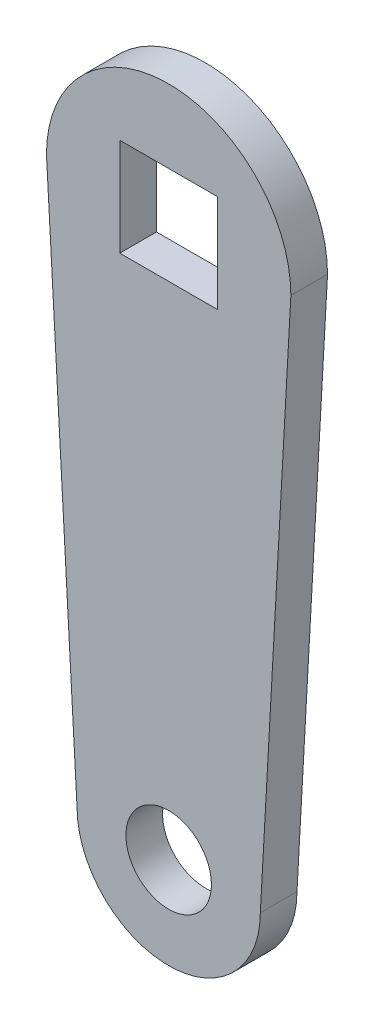
ISO-10303-21;
HEADER;
FILE_DESCRIPTION(('STEP AP214'),'2;1');
FILE_NAME('part.step','',(''),(''),'','','');
FILE_SCHEMA(('AUTOMOTIVE_DESIGN { 1 0 10303 214 1 1 1 1 }'));
ENDSEC;
DATA;
#1=APPLICATION_CONTEXT('core data for automotive mechanical design processes');
#2=APPLICATION_PROTOCOL_DEFINITION('international standard','automotive_design',2000,#1);
#3=PRODUCT_CONTEXT('',#1,'mechanical');
#4=PRODUCT('Part','Part','',(#3));
#5=PRODUCT_RELATED_PRODUCT_CATEGORY('part','',(#4));
#6=PRODUCT_DEFINITION_FORMATION('','',#4);
#7=PRODUCT_DEFINITION_CONTEXT('part definition',#1,'design');
#8=PRODUCT_DEFINITION('design','',#6,#7);
#9=PRODUCT_DEFINITION_SHAPE('','',#8);
#10=(LENGTH_UNIT() NAMED_UNIT(*) SI_UNIT(.MILLI.,.METRE.));
#11=(NAMED_UNIT(*) PLANE_ANGLE_UNIT() SI_UNIT($,.RADIAN.));
#12=(NAMED_UNIT(*) SI_UNIT($,.STERADIAN.) SOLID_ANGLE_UNIT());
#13=UNCERTAINTY_MEASURE_WITH_UNIT(LENGTH_MEASURE(1.E-05),#10,'distance_accuracy_value','');
#14=(GEOMETRIC_REPRESENTATION_CONTEXT(3) GLOBAL_UNCERTAINTY_ASSIGNED_CONTEXT((#13)) GLOBAL_UNIT_ASSIGNED_CONTEXT((#10,
#11,#12)) REPRESENTATION_CONTEXT('',''));
#15=CARTESIAN_POINT('',(0.,0.,0.));
#16=DIRECTION('',(0.,0.,1.));
#17=DIRECTION('',(1.,0.,0.));
#18=AXIS2_PLACEMENT_3D('',#15,#16,#17);
#19=CARTESIAN_POINT('',(0.,0.,3.));
#20=DIRECTION('',(0.,0.,1.));
#21=DIRECTION('',(1.,0.,0.));
#22=AXIS2_PLACEMENT_3D('',#19,#20,#21);
#23=PLANE('',#22);
#24=DIRECTION('',(1.,0.,0.));
#25=VECTOR('',#24,1.);
#26=CARTESIAN_POINT('',(4.,-4.,3.));
#27=LINE('',#26,#25);
#28=CARTESIAN_POINT('',(-4.,-4.,3.));
#29=VERTEX_POINT('',#28);
#30=CARTESIAN_POINT('',(4.,-4.,3.));
#31=VERTEX_POINT('',#30);
#32=EDGE_CURVE('E106',#29,#31,#27,.T.);
#33=ORIENTED_EDGE('',*,*,#32,.F.);
#34=DIRECTION('',(0.,-1.,0.));
#35=VECTOR('',#34,1.);
#36=CARTESIAN_POINT('',(-4.,-4.,3.));
#37=LINE('',#36,#35);
#38=CARTESIAN_POINT('',(-4.,4.,3.));
#39=VERTEX_POINT('',#38);
#40=EDGE_CURVE('E98',#39,#29,#37,.T.);
#41=ORIENTED_EDGE('',*,*,#40,.F.);
#42=DIRECTION('',(-1.,0.,0.));
#43=VECTOR('',#42,1.);
#44=CARTESIAN_POINT('',(4.,4.,3.));
#45=LINE('',#44,#43);
#46=CARTESIAN_POINT('',(4.,4.,3.));
#47=VERTEX_POINT('',#46);
#48=EDGE_CURVE('E121',#47,#39,#45,.T.);
#49=ORIENTED_EDGE('',*,*,#48,.F.);
#50=DIRECTION('',(0.,1.,0.));
#51=VECTOR('',#50,1.);
#52=CARTESIAN_POINT('',(4.,-4.,3.));
#53=LINE('',#52,#51);
#54=EDGE_CURVE('E119',#31,#47,#53,.T.);
#55=ORIENTED_EDGE('',*,*,#54,.F.);
#56=EDGE_LOOP('',(#33,#41,#49,#55));
#57=FACE_BOUND('',#56,.T.);
#58=CARTESIAN_POINT('',(0.,0.,3.));
#59=DIRECTION('',(0.,0.,1.));
#60=DIRECTION('',(1.,0.,0.));
#61=AXIS2_PLACEMENT_3D('',#58,#59,#60);
#62=CIRCLE('',#61,10.);
#63=CARTESIAN_POINT('',(10.,0.,3.));
#64=VERTEX_POINT('',#63);
#65=CARTESIAN_POINT('',(-10.,0.,3.));
#66=VERTEX_POINT('',#65);
#67=EDGE_CURVE('E137',#64,#66,#62,.T.);
#68=ORIENTED_EDGE('',*,*,#67,.T.);
#69=DIRECTION('',(0.055470019622523,-0.998460353205412,0.));
#70=VECTOR('',#69,1.);
#71=CARTESIAN_POINT('',(-10.,0.,3.));
#72=LINE('',#71,#70);
#73=CARTESIAN_POINT('',(-7.49999999999999,-45.,3.));
#74=VERTEX_POINT('',#73);
#75=EDGE_CURVE('E140',#66,#74,#72,.T.);
#76=ORIENTED_EDGE('',*,*,#75,.T.);
#77=CARTESIAN_POINT('',(0.,-45.,3.));
#78=DIRECTION('',(0.,0.,1.));
#79=DIRECTION('',(1.,0.,0.));
#80=AXIS2_PLACEMENT_3D('',#77,#78,#79);
#81=CIRCLE('',#80,7.5);
#82=CARTESIAN_POINT('',(7.50000000000001,-45.,3.));
#83=VERTEX_POINT('',#82);
#84=EDGE_CURVE('E143',#74,#83,#81,.T.);
#85=ORIENTED_EDGE('',*,*,#84,.T.);
#86=DIRECTION('',(0.0554700196225228,0.998460353205412,0.));
#87=VECTOR('',#86,1.);
#88=CARTESIAN_POINT('',(7.50000000000001,-45.,3.));
#89=LINE('',#88,#87);
#90=EDGE_CURVE('E145',#83,#64,#89,.T.);
#91=ORIENTED_EDGE('',*,*,#90,.T.);
#92=EDGE_LOOP('',(#68,#76,#85,#91));
#93=FACE_BOUND('',#92,.T.);
#94=CARTESIAN_POINT('',(0.,-45.,3.));
#95=DIRECTION('',(0.,0.,1.));
#96=DIRECTION('',(1.,0.,0.));
#97=AXIS2_PLACEMENT_3D('',#94,#95,#96);
#98=CIRCLE('',#97,3.5);
#99=CARTESIAN_POINT('',(3.50000000000001,-45.,3.));
#100=VERTEX_POINT('',#99);
#101=EDGE_CURVE('E127',#100,#100,#98,.T.);
#102=ORIENTED_EDGE('',*,*,#101,.F.);
#103=EDGE_LOOP('',(#102));
#104=FACE_BOUND('',#103,.T.);
#105=ADVANCED_FACE('F33',(#57,#93,#104),#23,.T.);
#106=CARTESIAN_POINT('',(0.,0.,0.));
#107=DIRECTION('',(0.,0.,1.));
#108=DIRECTION('',(1.,0.,0.));
#109=AXIS2_PLACEMENT_3D('',#106,#107,#108);
#110=PLANE('',#109);
#111=CARTESIAN_POINT('',(0.,0.,0.));
#112=DIRECTION('',(0.,0.,1.));
#113=DIRECTION('',(1.,0.,0.));
#114=AXIS2_PLACEMENT_3D('',#111,#112,#113);
#115=CIRCLE('',#114,10.);
#116=CARTESIAN_POINT('',(10.,0.,0.));
#117=VERTEX_POINT('',#116);
#118=CARTESIAN_POINT('',(-10.,0.,0.));
#119=VERTEX_POINT('',#118);
#120=EDGE_CURVE('E114',#117,#119,#115,.T.);
#121=ORIENTED_EDGE('',*,*,#120,.F.);
#122=DIRECTION('',(0.0554700196225228,0.998460353205412,0.));
#123=VECTOR('',#122,1.);
#124=CARTESIAN_POINT('',(7.50000000000001,-45.,0.));
#125=LINE('',#124,#123);
#126=CARTESIAN_POINT('',(7.50000000000001,-45.,0.));
#127=VERTEX_POINT('',#126);
#128=EDGE_CURVE('E141',#127,#117,#125,.T.);
#129=ORIENTED_EDGE('',*,*,#128,.F.);
#130=CARTESIAN_POINT('',(0.,-45.,0.));
#131=DIRECTION('',(0.,0.,1.));
#132=DIRECTION('',(1.,0.,0.));
#133=AXIS2_PLACEMENT_3D('',#130,#131,#132);
#134=CIRCLE('',#133,7.5);
#135=CARTESIAN_POINT('',(-7.49999999999999,-45.,0.));
#136=VERTEX_POINT('',#135);
#137=EDGE_CURVE('E152',#136,#127,#134,.T.);
#138=ORIENTED_EDGE('',*,*,#137,.F.);
#139=DIRECTION('',(0.055470019622523,-0.998460353205412,0.));
#140=VECTOR('',#139,1.);
#141=CARTESIAN_POINT('',(-10.,0.,0.));
#142=LINE('',#141,#140);
#143=EDGE_CURVE('E150',#119,#136,#142,.T.);
#144=ORIENTED_EDGE('',*,*,#143,.F.);
#145=EDGE_LOOP('',(#121,#129,#138,#144));
#146=FACE_BOUND('',#145,.T.);
#147=DIRECTION('',(0.,-1.,0.));
#148=VECTOR('',#147,1.);
#149=CARTESIAN_POINT('',(-4.,-4.,0.));
#150=LINE('',#149,#148);
#151=CARTESIAN_POINT('',(-4.,4.,0.));
#152=VERTEX_POINT('',#151);
#153=CARTESIAN_POINT('',(-4.,-4.,0.));
#154=VERTEX_POINT('',#153);
#155=EDGE_CURVE('E56',#152,#154,#150,.T.);
#156=ORIENTED_EDGE('',*,*,#155,.T.);
#157=DIRECTION('',(1.,0.,0.));
#158=VECTOR('',#157,1.);
#159=CARTESIAN_POINT('',(4.,-4.,0.));
#160=LINE('',#159,#158);
#161=CARTESIAN_POINT('',(4.,-4.,0.));
#162=VERTEX_POINT('',#161);
#163=EDGE_CURVE('E113',#154,#162,#160,.T.);
#164=ORIENTED_EDGE('',*,*,#163,.T.);
#165=DIRECTION('',(0.,1.,0.));
#166=VECTOR('',#165,1.);
#167=CARTESIAN_POINT('',(4.,-4.,0.));
#168=LINE('',#167,#166);
#169=CARTESIAN_POINT('',(4.,4.,0.));
#170=VERTEX_POINT('',#169);
#171=EDGE_CURVE('E129',#162,#170,#168,.T.);
#172=ORIENTED_EDGE('',*,*,#171,.T.);
#173=DIRECTION('',(-1.,0.,0.));
#174=VECTOR('',#173,1.);
#175=CARTESIAN_POINT('',(4.,4.,0.));
#176=LINE('',#175,#174);
#177=EDGE_CURVE('E107',#170,#152,#176,.T.);
#178=ORIENTED_EDGE('',*,*,#177,.T.);
#179=EDGE_LOOP('',(#156,#164,#172,#178));
#180=FACE_BOUND('',#179,.T.);
#181=CARTESIAN_POINT('',(0.,-45.,0.));
#182=DIRECTION('',(0.,0.,1.));
#183=DIRECTION('',(1.,0.,0.));
#184=AXIS2_PLACEMENT_3D('',#181,#182,#183);
#185=CIRCLE('',#184,3.5);
#186=CARTESIAN_POINT('',(3.50000000000001,-45.,0.));
#187=VERTEX_POINT('',#186);
#188=EDGE_CURVE('E223',#187,#187,#185,.T.);
#189=ORIENTED_EDGE('',*,*,#188,.T.);
#190=EDGE_LOOP('',(#189));
#191=FACE_BOUND('',#190,.T.);
#192=ADVANCED_FACE('F170',(#146,#180,#191),#110,.F.);
#193=CARTESIAN_POINT('',(0.,0.,3.));
#194=DIRECTION('',(0.,0.,-1.));
#195=DIRECTION('',(-1.,0.,0.));
#196=AXIS2_PLACEMENT_3D('',#193,#194,#195);
#197=CYLINDRICAL_SURFACE('',#196,10.);
#198=ORIENTED_EDGE('',*,*,#120,.T.);
#199=DIRECTION('',(0.,0.,-1.));
#200=VECTOR('',#199,1.);
#201=CARTESIAN_POINT('',(-10.,0.,3.));
#202=LINE('',#201,#200);
#203=EDGE_CURVE('E11',#66,#119,#202,.T.);
#204=ORIENTED_EDGE('',*,*,#203,.F.);
#205=ORIENTED_EDGE('',*,*,#67,.F.);
#206=DIRECTION('',(0.,0.,-1.));
#207=VECTOR('',#206,1.);
#208=CARTESIAN_POINT('',(10.,0.,3.));
#209=LINE('',#208,#207);
#210=EDGE_CURVE('E147',#64,#117,#209,.T.);
#211=ORIENTED_EDGE('',*,*,#210,.T.);
#212=EDGE_LOOP('',(#198,#204,#205,#211));
#213=FACE_BOUND('',#212,.T.);
#214=ADVANCED_FACE('F35',(#213),#197,.T.);
#215=CARTESIAN_POINT('',(-10.,0.,3.));
#216=DIRECTION('',(0.998460353205412,0.055470019622523,0.));
#217=DIRECTION('',(-0.055470019622523,0.998460353205413,0.));
#218=AXIS2_PLACEMENT_3D('',#215,#216,#217);
#219=PLANE('',#218);
#220=ORIENTED_EDGE('',*,*,#143,.T.);
#221=DIRECTION('',(0.,0.,-1.));
#222=VECTOR('',#221,1.);
#223=CARTESIAN_POINT('',(-7.49999999999999,-45.,3.));
#224=LINE('',#223,#222);
#225=EDGE_CURVE('E41',#74,#136,#224,.T.);
#226=ORIENTED_EDGE('',*,*,#225,.F.);
#227=ORIENTED_EDGE('',*,*,#75,.F.);
#228=ORIENTED_EDGE('',*,*,#203,.T.);
#229=EDGE_LOOP('',(#220,#226,#227,#228));
#230=FACE_BOUND('',#229,.T.);
#231=ADVANCED_FACE('F180',(#230),#219,.F.);
#232=CARTESIAN_POINT('',(0.,-45.,3.));
#233=DIRECTION('',(0.,0.,-1.));
#234=DIRECTION('',(-1.,0.,0.));
#235=AXIS2_PLACEMENT_3D('',#232,#233,#234);
#236=CYLINDRICAL_SURFACE('',#235,7.5);
#237=ORIENTED_EDGE('',*,*,#137,.T.);
#238=DIRECTION('',(0.,0.,-1.));
#239=VECTOR('',#238,1.);
#240=CARTESIAN_POINT('',(7.50000000000001,-45.,3.));
#241=LINE('',#240,#239);
#242=EDGE_CURVE('E157',#83,#127,#241,.T.);
#243=ORIENTED_EDGE('',*,*,#242,.F.);
#244=ORIENTED_EDGE('',*,*,#84,.F.);
#245=ORIENTED_EDGE('',*,*,#225,.T.);
#246=EDGE_LOOP('',(#237,#243,#244,#245));
#247=FACE_BOUND('',#246,.T.);
#248=ADVANCED_FACE('F164',(#247),#236,.T.);
#249=CARTESIAN_POINT('',(7.50000000000001,-45.,3.));
#250=DIRECTION('',(-0.998460353205412,0.0554700196225228,0.));
#251=DIRECTION('',(-0.0554700196225228,-0.998460353205413,0.));
#252=AXIS2_PLACEMENT_3D('',#249,#250,#251);
#253=PLANE('',#252);
#254=ORIENTED_EDGE('',*,*,#128,.T.);
#255=ORIENTED_EDGE('',*,*,#210,.F.);
#256=ORIENTED_EDGE('',*,*,#90,.F.);
#257=ORIENTED_EDGE('',*,*,#242,.T.);
#258=EDGE_LOOP('',(#254,#255,#256,#257));
#259=FACE_BOUND('',#258,.T.);
#260=ADVANCED_FACE('F174',(#259),#253,.F.);
#261=CARTESIAN_POINT('',(-4.,-4.,3.));
#262=DIRECTION('',(1.,0.,0.));
#263=DIRECTION('',(0.,0.,-1.));
#264=AXIS2_PLACEMENT_3D('',#261,#262,#263);
#265=PLANE('',#264);
#266=ORIENTED_EDGE('',*,*,#155,.F.);
#267=DIRECTION('',(0.,0.,-1.));
#268=VECTOR('',#267,1.);
#269=CARTESIAN_POINT('',(-4.,4.,3.));
#270=LINE('',#269,#268);
#271=EDGE_CURVE('E102',#39,#152,#270,.T.);
#272=ORIENTED_EDGE('',*,*,#271,.F.);
#273=ORIENTED_EDGE('',*,*,#40,.T.);
#274=DIRECTION('',(0.,0.,-1.));
#275=VECTOR('',#274,1.);
#276=CARTESIAN_POINT('',(-4.,-4.,3.));
#277=LINE('',#276,#275);
#278=EDGE_CURVE('E101',#29,#154,#277,.T.);
#279=ORIENTED_EDGE('',*,*,#278,.T.);
#280=EDGE_LOOP('',(#266,#272,#273,#279));
#281=FACE_BOUND('',#280,.T.);
#282=ADVANCED_FACE('F100',(#281),#265,.T.);
#283=CARTESIAN_POINT('',(4.,-4.,3.));
#284=DIRECTION('',(0.,1.,0.));
#285=DIRECTION('',(-1.,0.,0.));
#286=AXIS2_PLACEMENT_3D('',#283,#284,#285);
#287=PLANE('',#286);
#288=ORIENTED_EDGE('',*,*,#163,.F.);
#289=ORIENTED_EDGE('',*,*,#278,.F.);
#290=ORIENTED_EDGE('',*,*,#32,.T.);
#291=DIRECTION('',(0.,0.,-1.));
#292=VECTOR('',#291,1.);
#293=CARTESIAN_POINT('',(4.,-4.,3.));
#294=LINE('',#293,#292);
#295=EDGE_CURVE('E115',#31,#162,#294,.T.);
#296=ORIENTED_EDGE('',*,*,#295,.T.);
#297=EDGE_LOOP('',(#288,#289,#290,#296));
#298=FACE_BOUND('',#297,.T.);
#299=ADVANCED_FACE('F110',(#298),#287,.T.);
#300=CARTESIAN_POINT('',(4.,-4.,3.));
#301=DIRECTION('',(-1.,0.,0.));
#302=DIRECTION('',(0.,0.,1.));
#303=AXIS2_PLACEMENT_3D('',#300,#301,#302);
#304=PLANE('',#303);
#305=ORIENTED_EDGE('',*,*,#171,.F.);
#306=ORIENTED_EDGE('',*,*,#295,.F.);
#307=ORIENTED_EDGE('',*,*,#54,.T.);
#308=DIRECTION('',(0.,0.,-1.));
#309=VECTOR('',#308,1.);
#310=CARTESIAN_POINT('',(4.,4.,3.));
#311=LINE('',#310,#309);
#312=EDGE_CURVE('E48',#47,#170,#311,.T.);
#313=ORIENTED_EDGE('',*,*,#312,.T.);
#314=EDGE_LOOP('',(#305,#306,#307,#313));
#315=FACE_BOUND('',#314,.T.);
#316=ADVANCED_FACE('F203',(#315),#304,.T.);
#317=CARTESIAN_POINT('',(4.,4.,3.));
#318=DIRECTION('',(0.,-1.,0.));
#319=DIRECTION('',(1.,0.,0.));
#320=AXIS2_PLACEMENT_3D('',#317,#318,#319);
#321=PLANE('',#320);
#322=ORIENTED_EDGE('',*,*,#177,.F.);
#323=ORIENTED_EDGE('',*,*,#312,.F.);
#324=ORIENTED_EDGE('',*,*,#48,.T.);
#325=ORIENTED_EDGE('',*,*,#271,.T.);
#326=EDGE_LOOP('',(#322,#323,#324,#325));
#327=FACE_BOUND('',#326,.T.);
#328=ADVANCED_FACE('F207',(#327),#321,.T.);
#329=CARTESIAN_POINT('',(0.,-45.,3.));
#330=DIRECTION('',(0.,0.,-1.));
#331=DIRECTION('',(-1.,0.,0.));
#332=AXIS2_PLACEMENT_3D('',#329,#330,#331);
#333=CYLINDRICAL_SURFACE('',#332,3.5);
#334=ORIENTED_EDGE('',*,*,#101,.T.);
#335=EDGE_LOOP('',(#334));
#336=FACE_BOUND('',#335,.T.);
#337=ORIENTED_EDGE('',*,*,#188,.F.);
#338=EDGE_LOOP('',(#337));
#339=FACE_BOUND('',#338,.T.);
#340=ADVANCED_FACE('F213',(#336,#339),#333,.F.);
#341=CLOSED_SHELL('',(#105,#192,#214,#231,#248,#260,#282,#299,#316,#328,#340));
#342=MANIFOLD_SOLID_BREP('B2',#341);
#343=ADVANCED_BREP_SHAPE_REPRESENTATION('',(#18,#342),#14);
#344=SHAPE_DEFINITION_REPRESENTATION(#9,#343);
ENDSEC;
END-ISO-10303-21;
